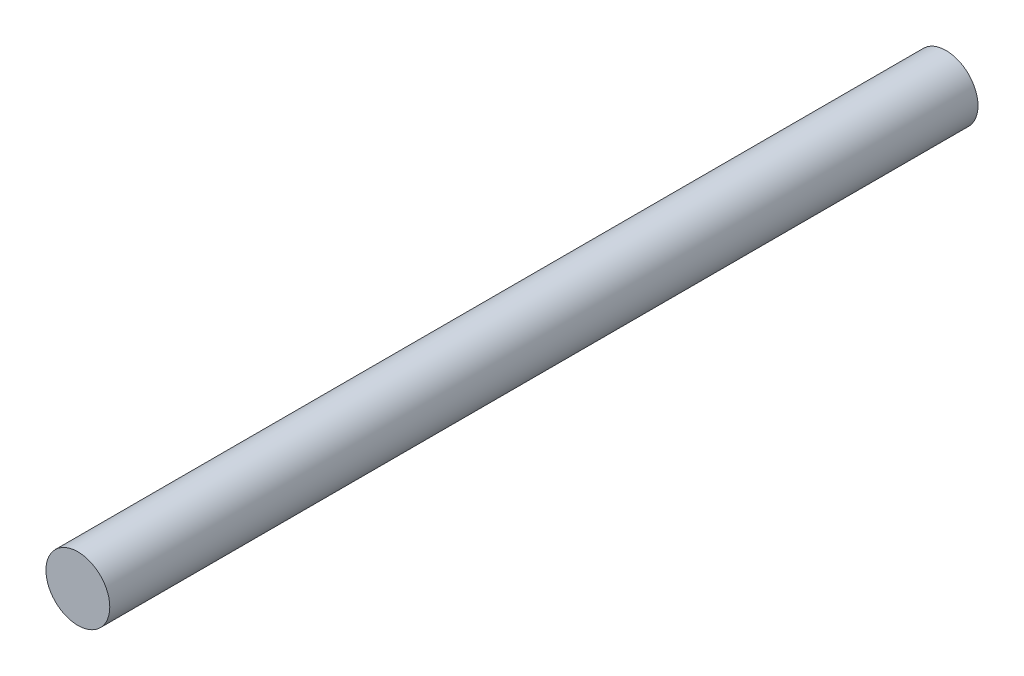
ISO-10303-21;
HEADER;
FILE_DESCRIPTION(('STEP AP214'),'2;1');
FILE_NAME('part.step','',(''),(''),'','','');
FILE_SCHEMA(('AUTOMOTIVE_DESIGN { 1 0 10303 214 1 1 1 1 }'));
ENDSEC;
DATA;
#1=APPLICATION_CONTEXT('core data for automotive mechanical design processes');
#2=APPLICATION_PROTOCOL_DEFINITION('international standard','automotive_design',2000,#1);
#3=PRODUCT_CONTEXT('',#1,'mechanical');
#4=PRODUCT('Part','Part','',(#3));
#5=PRODUCT_RELATED_PRODUCT_CATEGORY('part','',(#4));
#6=PRODUCT_DEFINITION_FORMATION('','',#4);
#7=PRODUCT_DEFINITION_CONTEXT('part definition',#1,'design');
#8=PRODUCT_DEFINITION('design','',#6,#7);
#9=PRODUCT_DEFINITION_SHAPE('','',#8);
#10=(LENGTH_UNIT() NAMED_UNIT(*) SI_UNIT(.MILLI.,.METRE.));
#11=(NAMED_UNIT(*) PLANE_ANGLE_UNIT() SI_UNIT($,.RADIAN.));
#12=(NAMED_UNIT(*) SI_UNIT($,.STERADIAN.) SOLID_ANGLE_UNIT());
#13=UNCERTAINTY_MEASURE_WITH_UNIT(LENGTH_MEASURE(1.E-05),#10,'distance_accuracy_value','');
#14=(GEOMETRIC_REPRESENTATION_CONTEXT(3) GLOBAL_UNCERTAINTY_ASSIGNED_CONTEXT((#13)) GLOBAL_UNIT_ASSIGNED_CONTEXT((#10,
#11,#12)) REPRESENTATION_CONTEXT('',''));
#15=CARTESIAN_POINT('',(0.,0.,0.));
#16=DIRECTION('',(0.,0.,1.));
#17=DIRECTION('',(1.,0.,0.));
#18=AXIS2_PLACEMENT_3D('',#15,#16,#17);
#19=CARTESIAN_POINT('',(0.,0.,-43.18));
#20=DIRECTION('',(0.,0.,1.));
#21=DIRECTION('',(1.,0.,0.));
#22=AXIS2_PLACEMENT_3D('',#19,#20,#21);
#23=CYLINDRICAL_SURFACE('',#22,1.5875);
#24=CARTESIAN_POINT('',(0.,0.,-43.18));
#25=DIRECTION('',(0.,0.,1.));
#26=DIRECTION('',(1.,0.,0.));
#27=AXIS2_PLACEMENT_3D('',#24,#25,#26);
#28=CIRCLE('',#27,1.5875);
#29=CARTESIAN_POINT('',(1.5875,0.,-43.18));
#30=VERTEX_POINT('',#29);
#31=EDGE_CURVE('E10',#30,#30,#28,.T.);
#32=ORIENTED_EDGE('',*,*,#31,.T.);
#33=EDGE_LOOP('',(#32));
#34=FACE_BOUND('',#33,.T.);
#35=CARTESIAN_POINT('',(0.,0.,0.));
#36=DIRECTION('',(0.,0.,1.));
#37=DIRECTION('',(1.,0.,0.));
#38=AXIS2_PLACEMENT_3D('',#35,#36,#37);
#39=CIRCLE('',#38,1.5875);
#40=CARTESIAN_POINT('',(1.5875,0.,0.));
#41=VERTEX_POINT('',#40);
#42=EDGE_CURVE('E34',#41,#41,#39,.T.);
#43=ORIENTED_EDGE('',*,*,#42,.F.);
#44=EDGE_LOOP('',(#43));
#45=FACE_BOUND('',#44,.T.);
#46=ADVANCED_FACE('F31',(#34,#45),#23,.T.);
#47=CARTESIAN_POINT('',(0.,0.,-43.18));
#48=DIRECTION('',(0.,0.,1.));
#49=DIRECTION('',(1.,0.,0.));
#50=AXIS2_PLACEMENT_3D('',#47,#48,#49);
#51=PLANE('',#50);
#52=ORIENTED_EDGE('',*,*,#31,.F.);
#53=EDGE_LOOP('',(#52));
#54=FACE_BOUND('',#53,.T.);
#55=ADVANCED_FACE('F46',(#54),#51,.F.);
#56=CARTESIAN_POINT('',(0.,0.,0.));
#57=DIRECTION('',(0.,0.,1.));
#58=DIRECTION('',(1.,0.,0.));
#59=AXIS2_PLACEMENT_3D('',#56,#57,#58);
#60=PLANE('',#59);
#61=ORIENTED_EDGE('',*,*,#42,.T.);
#62=EDGE_LOOP('',(#61));
#63=FACE_BOUND('',#62,.T.);
#64=ADVANCED_FACE('F43',(#63),#60,.T.);
#65=CLOSED_SHELL('',(#46,#55,#64));
#66=MANIFOLD_SOLID_BREP('B2',#65);
#67=ADVANCED_BREP_SHAPE_REPRESENTATION('',(#18,#66),#14);
#68=SHAPE_DEFINITION_REPRESENTATION(#9,#67);
ENDSEC;
END-ISO-10303-21;
